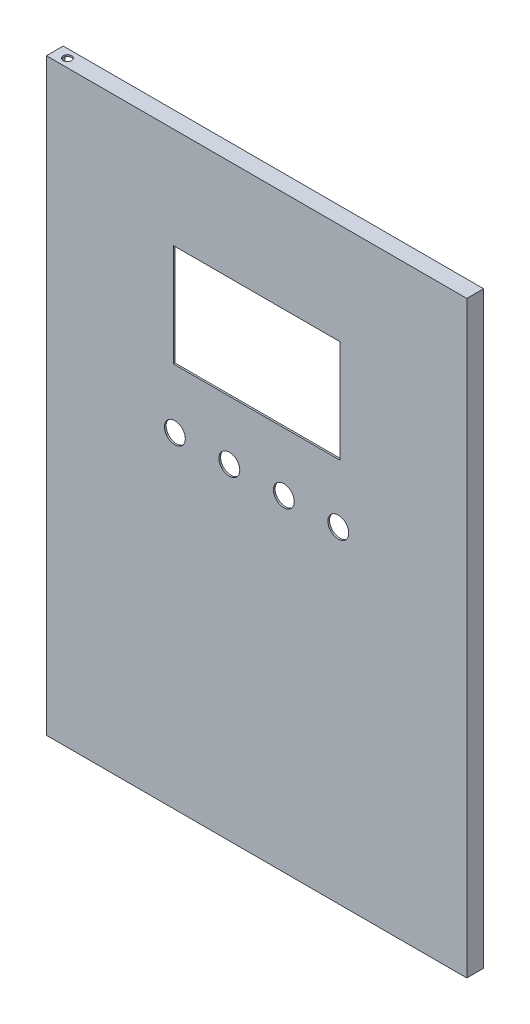
ISO-10303-21;
HEADER;
FILE_DESCRIPTION(('STEP AP214'),'2;1');
FILE_NAME('part.step','',(''),(''),'','','');
FILE_SCHEMA(('AUTOMOTIVE_DESIGN { 1 0 10303 214 1 1 1 1 }'));
ENDSEC;
DATA;
#1=APPLICATION_CONTEXT('core data for automotive mechanical design processes');
#2=APPLICATION_PROTOCOL_DEFINITION('international standard','automotive_design',2000,#1);
#3=PRODUCT_CONTEXT('',#1,'mechanical');
#4=PRODUCT('Part','Part','',(#3));
#5=PRODUCT_RELATED_PRODUCT_CATEGORY('part','',(#4));
#6=PRODUCT_DEFINITION_FORMATION('','',#4);
#7=PRODUCT_DEFINITION_CONTEXT('part definition',#1,'design');
#8=PRODUCT_DEFINITION('design','',#6,#7);
#9=PRODUCT_DEFINITION_SHAPE('','',#8);
#10=(LENGTH_UNIT() NAMED_UNIT(*) SI_UNIT(.MILLI.,.METRE.));
#11=(NAMED_UNIT(*) PLANE_ANGLE_UNIT() SI_UNIT($,.RADIAN.));
#12=(NAMED_UNIT(*) SI_UNIT($,.STERADIAN.) SOLID_ANGLE_UNIT());
#13=UNCERTAINTY_MEASURE_WITH_UNIT(LENGTH_MEASURE(1.E-05),#10,'distance_accuracy_value','');
#14=(GEOMETRIC_REPRESENTATION_CONTEXT(3) GLOBAL_UNCERTAINTY_ASSIGNED_CONTEXT((#13)) GLOBAL_UNIT_ASSIGNED_CONTEXT((#10,
#11,#12)) REPRESENTATION_CONTEXT('',''));
#15=CARTESIAN_POINT('',(0.,0.,0.));
#16=DIRECTION('',(0.,0.,1.));
#17=DIRECTION('',(1.,0.,0.));
#18=AXIS2_PLACEMENT_3D('',#15,#16,#17);
#19=CARTESIAN_POINT('',(0.,0.,10.));
#20=DIRECTION('',(1.,0.,0.));
#21=DIRECTION('',(0.,1.,0.));
#22=AXIS2_PLACEMENT_3D('',#19,#20,#21);
#23=PLANE('',#22);
#24=DIRECTION('',(0.,-1.,0.));
#25=VECTOR('',#24,1.);
#26=CARTESIAN_POINT('',(0.,0.,0.));
#27=LINE('',#26,#25);
#28=CARTESIAN_POINT('',(0.,0.,0.));
#29=VERTEX_POINT('',#28);
#30=CARTESIAN_POINT('',(0.,-350.,0.));
#31=VERTEX_POINT('',#30);
#32=EDGE_CURVE('E189',#29,#31,#27,.T.);
#33=ORIENTED_EDGE('',*,*,#32,.T.);
#34=DIRECTION('',(0.,0.,-1.));
#35=VECTOR('',#34,1.);
#36=CARTESIAN_POINT('',(0.,-350.,10.));
#37=LINE('',#36,#35);
#38=CARTESIAN_POINT('',(0.,-350.,10.));
#39=VERTEX_POINT('',#38);
#40=EDGE_CURVE('E222',#39,#31,#37,.T.);
#41=ORIENTED_EDGE('',*,*,#40,.F.);
#42=DIRECTION('',(0.,-1.,0.));
#43=VECTOR('',#42,1.);
#44=CARTESIAN_POINT('',(0.,0.,10.));
#45=LINE('',#44,#43);
#46=CARTESIAN_POINT('',(0.,0.,10.));
#47=VERTEX_POINT('',#46);
#48=EDGE_CURVE('E196',#47,#39,#45,.T.);
#49=ORIENTED_EDGE('',*,*,#48,.F.);
#50=DIRECTION('',(0.,0.,-1.));
#51=VECTOR('',#50,1.);
#52=CARTESIAN_POINT('',(0.,0.,10.));
#53=LINE('',#52,#51);
#54=EDGE_CURVE('E206',#47,#29,#53,.T.);
#55=ORIENTED_EDGE('',*,*,#54,.T.);
#56=EDGE_LOOP('',(#33,#41,#49,#55));
#57=FACE_BOUND('',#56,.T.);
#58=ADVANCED_FACE('F38',(#57),#23,.F.);
#59=CARTESIAN_POINT('',(0.,-350.,10.));
#60=DIRECTION('',(0.,1.,0.));
#61=DIRECTION('',(0.,0.,1.));
#62=AXIS2_PLACEMENT_3D('',#59,#60,#61);
#63=PLANE('',#62);
#64=CARTESIAN_POINT('',(7.5,-350.,5.));
#65=DIRECTION('',(0.,1.,0.));
#66=DIRECTION('',(0.,0.,1.));
#67=AXIS2_PLACEMENT_3D('',#64,#65,#66);
#68=CIRCLE('',#67,2.5);
#69=CARTESIAN_POINT('',(7.5,-350.,7.5));
#70=VERTEX_POINT('',#69);
#71=EDGE_CURVE('E151',#70,#70,#68,.T.);
#72=ORIENTED_EDGE('',*,*,#71,.T.);
#73=EDGE_LOOP('',(#72));
#74=FACE_BOUND('',#73,.T.);
#75=DIRECTION('',(1.,0.,0.));
#76=VECTOR('',#75,1.);
#77=CARTESIAN_POINT('',(0.,-350.,0.));
#78=LINE('',#77,#76);
#79=CARTESIAN_POINT('',(250.,-350.,0.));
#80=VERTEX_POINT('',#79);
#81=EDGE_CURVE('E209',#31,#80,#78,.T.);
#82=ORIENTED_EDGE('',*,*,#81,.T.);
#83=DIRECTION('',(0.,0.,-1.));
#84=VECTOR('',#83,1.);
#85=CARTESIAN_POINT('',(250.,-350.,10.));
#86=LINE('',#85,#84);
#87=CARTESIAN_POINT('',(250.,-350.,10.));
#88=VERTEX_POINT('',#87);
#89=EDGE_CURVE('E219',#88,#80,#86,.T.);
#90=ORIENTED_EDGE('',*,*,#89,.F.);
#91=DIRECTION('',(1.,0.,0.));
#92=VECTOR('',#91,1.);
#93=CARTESIAN_POINT('',(0.,-350.,10.));
#94=LINE('',#93,#92);
#95=EDGE_CURVE('E199',#39,#88,#94,.T.);
#96=ORIENTED_EDGE('',*,*,#95,.F.);
#97=ORIENTED_EDGE('',*,*,#40,.T.);
#98=EDGE_LOOP('',(#82,#90,#96,#97));
#99=FACE_BOUND('',#98,.T.);
#100=ADVANCED_FACE('F290',(#74,#99),#63,.F.);
#101=CARTESIAN_POINT('',(250.,0.,10.));
#102=DIRECTION('',(-1.,0.,0.));
#103=DIRECTION('',(0.,-1.,0.));
#104=AXIS2_PLACEMENT_3D('',#101,#102,#103);
#105=PLANE('',#104);
#106=DIRECTION('',(0.,1.,0.));
#107=VECTOR('',#106,1.);
#108=CARTESIAN_POINT('',(250.,0.,0.));
#109=LINE('',#108,#107);
#110=CARTESIAN_POINT('',(250.,0.,0.));
#111=VERTEX_POINT('',#110);
#112=EDGE_CURVE('E211',#80,#111,#109,.T.);
#113=ORIENTED_EDGE('',*,*,#112,.T.);
#114=DIRECTION('',(0.,0.,-1.));
#115=VECTOR('',#114,1.);
#116=CARTESIAN_POINT('',(250.,0.,10.));
#117=LINE('',#116,#115);
#118=CARTESIAN_POINT('',(250.,0.,10.));
#119=VERTEX_POINT('',#118);
#120=EDGE_CURVE('E216',#119,#111,#117,.T.);
#121=ORIENTED_EDGE('',*,*,#120,.F.);
#122=DIRECTION('',(0.,1.,0.));
#123=VECTOR('',#122,1.);
#124=CARTESIAN_POINT('',(250.,0.,10.));
#125=LINE('',#124,#123);
#126=EDGE_CURVE('E202',#88,#119,#125,.T.);
#127=ORIENTED_EDGE('',*,*,#126,.F.);
#128=ORIENTED_EDGE('',*,*,#89,.T.);
#129=EDGE_LOOP('',(#113,#121,#127,#128));
#130=FACE_BOUND('',#129,.T.);
#131=ADVANCED_FACE('F295',(#130),#105,.F.);
#132=CARTESIAN_POINT('',(0.,0.,10.));
#133=DIRECTION('',(0.,-1.,0.));
#134=DIRECTION('',(0.,0.,-1.));
#135=AXIS2_PLACEMENT_3D('',#132,#133,#134);
#136=PLANE('',#135);
#137=CARTESIAN_POINT('',(7.5,0.,5.));
#138=DIRECTION('',(0.,-1.,0.));
#139=DIRECTION('',(0.,0.,-1.));
#140=AXIS2_PLACEMENT_3D('',#137,#138,#139);
#141=CIRCLE('',#140,2.5);
#142=CARTESIAN_POINT('',(7.5,0.,2.5));
#143=VERTEX_POINT('',#142);
#144=EDGE_CURVE('E160',#143,#143,#141,.T.);
#145=ORIENTED_EDGE('',*,*,#144,.T.);
#146=EDGE_LOOP('',(#145));
#147=FACE_BOUND('',#146,.T.);
#148=DIRECTION('',(-1.,0.,0.));
#149=VECTOR('',#148,1.);
#150=CARTESIAN_POINT('',(0.,0.,0.));
#151=LINE('',#150,#149);
#152=EDGE_CURVE('E200',#111,#29,#151,.T.);
#153=ORIENTED_EDGE('',*,*,#152,.T.);
#154=ORIENTED_EDGE('',*,*,#54,.F.);
#155=DIRECTION('',(-1.,0.,0.));
#156=VECTOR('',#155,1.);
#157=CARTESIAN_POINT('',(0.,0.,10.));
#158=LINE('',#157,#156);
#159=EDGE_CURVE('E204',#119,#47,#158,.T.);
#160=ORIENTED_EDGE('',*,*,#159,.F.);
#161=ORIENTED_EDGE('',*,*,#120,.T.);
#162=EDGE_LOOP('',(#153,#154,#160,#161));
#163=FACE_BOUND('',#162,.T.);
#164=ADVANCED_FACE('F269',(#147,#163),#136,.F.);
#165=CARTESIAN_POINT('',(0.,0.,10.));
#166=DIRECTION('',(0.,0.,1.));
#167=DIRECTION('',(1.,0.,0.));
#168=AXIS2_PLACEMENT_3D('',#165,#166,#167);
#169=PLANE('',#168);
#170=CARTESIAN_POINT('',(173.6,-156.,10.));
#171=DIRECTION('',(0.,0.,1.));
#172=DIRECTION('',(-1.,0.,0.));
#173=AXIS2_PLACEMENT_3D('',#170,#171,#172);
#174=CIRCLE('',#173,6.20000000000001);
#175=CARTESIAN_POINT('',(167.4,-156.,10.));
#176=VERTEX_POINT('',#175);
#177=EDGE_CURVE('E249',#176,#176,#174,.T.);
#178=ORIENTED_EDGE('',*,*,#177,.F.);
#179=EDGE_LOOP('',(#178));
#180=FACE_BOUND('',#179,.T.);
#181=CARTESIAN_POINT('',(76.4,-156.,10.));
#182=DIRECTION('',(0.,0.,1.));
#183=DIRECTION('',(1.,0.,0.));
#184=AXIS2_PLACEMENT_3D('',#181,#182,#183);
#185=CIRCLE('',#184,6.19999999999999);
#186=CARTESIAN_POINT('',(82.6,-156.,10.));
#187=VERTEX_POINT('',#186);
#188=EDGE_CURVE('E255',#187,#187,#185,.T.);
#189=ORIENTED_EDGE('',*,*,#188,.F.);
#190=EDGE_LOOP('',(#189));
#191=FACE_BOUND('',#190,.T.);
#192=CARTESIAN_POINT('',(141.2,-156.,10.));
#193=DIRECTION('',(0.,0.,1.));
#194=DIRECTION('',(1.,0.,0.));
#195=AXIS2_PLACEMENT_3D('',#192,#193,#194);
#196=CIRCLE('',#195,6.20000000000001);
#197=CARTESIAN_POINT('',(147.4,-156.,10.));
#198=VERTEX_POINT('',#197);
#199=EDGE_CURVE('E244',#198,#198,#196,.T.);
#200=ORIENTED_EDGE('',*,*,#199,.F.);
#201=EDGE_LOOP('',(#200));
#202=FACE_BOUND('',#201,.T.);
#203=CARTESIAN_POINT('',(108.8,-156.,10.));
#204=DIRECTION('',(0.,0.,1.));
#205=DIRECTION('',(1.,0.,0.));
#206=AXIS2_PLACEMENT_3D('',#203,#204,#205);
#207=CIRCLE('',#206,6.20000000000001);
#208=CARTESIAN_POINT('',(115.,-156.,10.));
#209=VERTEX_POINT('',#208);
#210=EDGE_CURVE('E238',#209,#209,#207,.T.);
#211=ORIENTED_EDGE('',*,*,#210,.F.);
#212=EDGE_LOOP('',(#211));
#213=FACE_BOUND('',#212,.T.);
#214=DIRECTION('',(1.,0.,0.));
#215=VECTOR('',#214,1.);
#216=CARTESIAN_POINT('',(75.5,-121.,10.));
#217=LINE('',#216,#215);
#218=CARTESIAN_POINT('',(75.5,-121.,10.));
#219=VERTEX_POINT('',#218);
#220=CARTESIAN_POINT('',(174.5,-121.,10.));
#221=VERTEX_POINT('',#220);
#222=EDGE_CURVE('E52',#219,#221,#217,.T.);
#223=ORIENTED_EDGE('',*,*,#222,.F.);
#224=DIRECTION('',(0.,-1.,0.));
#225=VECTOR('',#224,1.);
#226=CARTESIAN_POINT('',(75.5,-60.,10.));
#227=LINE('',#226,#225);
#228=CARTESIAN_POINT('',(75.5,-60.,10.));
#229=VERTEX_POINT('',#228);
#230=EDGE_CURVE('E144',#229,#219,#227,.T.);
#231=ORIENTED_EDGE('',*,*,#230,.F.);
#232=DIRECTION('',(1.,0.,0.));
#233=VECTOR('',#232,1.);
#234=CARTESIAN_POINT('',(75.5,-60.,10.));
#235=LINE('',#234,#233);
#236=CARTESIAN_POINT('',(174.5,-60.,10.));
#237=VERTEX_POINT('',#236);
#238=EDGE_CURVE('E128',#229,#237,#235,.T.);
#239=ORIENTED_EDGE('',*,*,#238,.T.);
#240=DIRECTION('',(0.,-1.,0.));
#241=VECTOR('',#240,1.);
#242=CARTESIAN_POINT('',(174.5,-60.,10.));
#243=LINE('',#242,#241);
#244=EDGE_CURVE('E137',#237,#221,#243,.T.);
#245=ORIENTED_EDGE('',*,*,#244,.T.);
#246=EDGE_LOOP('',(#223,#231,#239,#245));
#247=FACE_BOUND('',#246,.T.);
#248=ORIENTED_EDGE('',*,*,#48,.T.);
#249=ORIENTED_EDGE('',*,*,#95,.T.);
#250=ORIENTED_EDGE('',*,*,#126,.T.);
#251=ORIENTED_EDGE('',*,*,#159,.T.);
#252=EDGE_LOOP('',(#248,#249,#250,#251));
#253=FACE_BOUND('',#252,.T.);
#254=ADVANCED_FACE('F141',(#180,#191,#202,#213,#247,#253),#169,.T.);
#255=CARTESIAN_POINT('',(0.,0.,0.));
#256=DIRECTION('',(0.,0.,1.));
#257=DIRECTION('',(1.,0.,0.));
#258=AXIS2_PLACEMENT_3D('',#255,#256,#257);
#259=PLANE('',#258);
#260=DIRECTION('',(0.,-1.,0.));
#261=VECTOR('',#260,1.);
#262=CARTESIAN_POINT('',(249.,-1.00000000000005,0.));
#263=LINE('',#262,#261);
#264=CARTESIAN_POINT('',(249.,-1.00000000000005,0.));
#265=VERTEX_POINT('',#264);
#266=CARTESIAN_POINT('',(249.,-349.,0.));
#267=VERTEX_POINT('',#266);
#268=EDGE_CURVE('E179',#265,#267,#263,.T.);
#269=ORIENTED_EDGE('',*,*,#268,.F.);
#270=DIRECTION('',(1.,0.,0.));
#271=VECTOR('',#270,1.);
#272=CARTESIAN_POINT('',(1.,-1.,0.));
#273=LINE('',#272,#271);
#274=CARTESIAN_POINT('',(1.,-1.,0.));
#275=VERTEX_POINT('',#274);
#276=EDGE_CURVE('E163',#275,#265,#273,.T.);
#277=ORIENTED_EDGE('',*,*,#276,.F.);
#278=DIRECTION('',(0.,1.,0.));
#279=VECTOR('',#278,1.);
#280=CARTESIAN_POINT('',(1.,-349.,0.));
#281=LINE('',#280,#279);
#282=CARTESIAN_POINT('',(1.,-349.,0.));
#283=VERTEX_POINT('',#282);
#284=EDGE_CURVE('E168',#283,#275,#281,.T.);
#285=ORIENTED_EDGE('',*,*,#284,.F.);
#286=DIRECTION('',(-1.,0.,0.));
#287=VECTOR('',#286,1.);
#288=CARTESIAN_POINT('',(249.,-349.,0.));
#289=LINE('',#288,#287);
#290=EDGE_CURVE('E182',#267,#283,#289,.T.);
#291=ORIENTED_EDGE('',*,*,#290,.F.);
#292=EDGE_LOOP('',(#269,#277,#285,#291));
#293=FACE_BOUND('',#292,.T.);
#294=ORIENTED_EDGE('',*,*,#32,.F.);
#295=ORIENTED_EDGE('',*,*,#152,.F.);
#296=ORIENTED_EDGE('',*,*,#112,.F.);
#297=ORIENTED_EDGE('',*,*,#81,.F.);
#298=EDGE_LOOP('',(#294,#295,#296,#297));
#299=FACE_BOUND('',#298,.T.);
#300=ADVANCED_FACE('F268',(#293,#299),#259,.F.);
#301=CARTESIAN_POINT('',(1.,-1.,9.));
#302=DIRECTION('',(0.,1.,0.));
#303=DIRECTION('',(-1.,0.,0.));
#304=AXIS2_PLACEMENT_3D('',#301,#302,#303);
#305=PLANE('',#304);
#306=CARTESIAN_POINT('',(7.5,-1.,5.));
#307=DIRECTION('',(0.,1.,0.));
#308=DIRECTION('',(-1.,0.,0.));
#309=AXIS2_PLACEMENT_3D('',#306,#307,#308);
#310=CIRCLE('',#309,2.5);
#311=CARTESIAN_POINT('',(5.,-1.,5.));
#312=VERTEX_POINT('',#311);
#313=EDGE_CURVE('E157',#312,#312,#310,.T.);
#314=ORIENTED_EDGE('',*,*,#313,.T.);
#315=EDGE_LOOP('',(#314));
#316=FACE_BOUND('',#315,.T.);
#317=ORIENTED_EDGE('',*,*,#276,.T.);
#318=DIRECTION('',(0.,0.,-1.));
#319=VECTOR('',#318,1.);
#320=CARTESIAN_POINT('',(249.,-1.00000000000005,9.));
#321=LINE('',#320,#319);
#322=CARTESIAN_POINT('',(249.,-1.00000000000005,9.));
#323=VERTEX_POINT('',#322);
#324=EDGE_CURVE('E177',#323,#265,#321,.T.);
#325=ORIENTED_EDGE('',*,*,#324,.F.);
#326=DIRECTION('',(1.,0.,0.));
#327=VECTOR('',#326,1.);
#328=CARTESIAN_POINT('',(1.,-1.,9.));
#329=LINE('',#328,#327);
#330=CARTESIAN_POINT('',(1.,-1.,9.));
#331=VERTEX_POINT('',#330);
#332=EDGE_CURVE('E164',#331,#323,#329,.T.);
#333=ORIENTED_EDGE('',*,*,#332,.F.);
#334=DIRECTION('',(0.,0.,-1.));
#335=VECTOR('',#334,1.);
#336=CARTESIAN_POINT('',(1.,-1.,9.));
#337=LINE('',#336,#335);
#338=EDGE_CURVE('E187',#331,#275,#337,.T.);
#339=ORIENTED_EDGE('',*,*,#338,.T.);
#340=EDGE_LOOP('',(#317,#325,#333,#339));
#341=FACE_BOUND('',#340,.T.);
#342=ADVANCED_FACE('F320',(#316,#341),#305,.F.);
#343=CARTESIAN_POINT('',(1.,-349.,9.));
#344=DIRECTION('',(-1.,0.,0.));
#345=DIRECTION('',(0.,0.,1.));
#346=AXIS2_PLACEMENT_3D('',#343,#344,#345);
#347=PLANE('',#346);
#348=ORIENTED_EDGE('',*,*,#284,.T.);
#349=ORIENTED_EDGE('',*,*,#338,.F.);
#350=DIRECTION('',(0.,1.,0.));
#351=VECTOR('',#350,1.);
#352=CARTESIAN_POINT('',(1.,-349.,9.));
#353=LINE('',#352,#351);
#354=CARTESIAN_POINT('',(1.,-349.,9.));
#355=VERTEX_POINT('',#354);
#356=EDGE_CURVE('E174',#355,#331,#353,.T.);
#357=ORIENTED_EDGE('',*,*,#356,.F.);
#358=DIRECTION('',(0.,0.,-1.));
#359=VECTOR('',#358,1.);
#360=CARTESIAN_POINT('',(1.,-349.,9.));
#361=LINE('',#360,#359);
#362=EDGE_CURVE('E190',#355,#283,#361,.T.);
#363=ORIENTED_EDGE('',*,*,#362,.T.);
#364=EDGE_LOOP('',(#348,#349,#357,#363));
#365=FACE_BOUND('',#364,.T.);
#366=ADVANCED_FACE('F325',(#365),#347,.F.);
#367=CARTESIAN_POINT('',(249.,-349.,9.));
#368=DIRECTION('',(0.,-1.,0.));
#369=DIRECTION('',(0.,0.,-1.));
#370=AXIS2_PLACEMENT_3D('',#367,#368,#369);
#371=PLANE('',#370);
#372=CARTESIAN_POINT('',(7.5,-349.,5.));
#373=DIRECTION('',(0.,-1.,0.));
#374=DIRECTION('',(0.,0.,-1.));
#375=AXIS2_PLACEMENT_3D('',#372,#373,#374);
#376=CIRCLE('',#375,2.5);
#377=CARTESIAN_POINT('',(7.5,-349.,2.5));
#378=VERTEX_POINT('',#377);
#379=EDGE_CURVE('E156',#378,#378,#376,.T.);
#380=ORIENTED_EDGE('',*,*,#379,.T.);
#381=EDGE_LOOP('',(#380));
#382=FACE_BOUND('',#381,.T.);
#383=ORIENTED_EDGE('',*,*,#290,.T.);
#384=ORIENTED_EDGE('',*,*,#362,.F.);
#385=DIRECTION('',(-1.,0.,0.));
#386=VECTOR('',#385,1.);
#387=CARTESIAN_POINT('',(249.,-349.,9.));
#388=LINE('',#387,#386);
#389=CARTESIAN_POINT('',(249.,-349.,9.));
#390=VERTEX_POINT('',#389);
#391=EDGE_CURVE('E171',#390,#355,#388,.T.);
#392=ORIENTED_EDGE('',*,*,#391,.F.);
#393=DIRECTION('',(0.,0.,-1.));
#394=VECTOR('',#393,1.);
#395=CARTESIAN_POINT('',(249.,-349.,9.));
#396=LINE('',#395,#394);
#397=EDGE_CURVE('E192',#390,#267,#396,.T.);
#398=ORIENTED_EDGE('',*,*,#397,.T.);
#399=EDGE_LOOP('',(#383,#384,#392,#398));
#400=FACE_BOUND('',#399,.T.);
#401=ADVANCED_FACE('F330',(#382,#400),#371,.F.);
#402=CARTESIAN_POINT('',(249.,-1.00000000000005,9.));
#403=DIRECTION('',(1.,0.,0.));
#404=DIRECTION('',(0.,1.,0.));
#405=AXIS2_PLACEMENT_3D('',#402,#403,#404);
#406=PLANE('',#405);
#407=ORIENTED_EDGE('',*,*,#268,.T.);
#408=ORIENTED_EDGE('',*,*,#397,.F.);
#409=DIRECTION('',(0.,-1.,0.));
#410=VECTOR('',#409,1.);
#411=CARTESIAN_POINT('',(249.,-1.00000000000005,9.));
#412=LINE('',#411,#410);
#413=EDGE_CURVE('E167',#323,#390,#412,.T.);
#414=ORIENTED_EDGE('',*,*,#413,.F.);
#415=ORIENTED_EDGE('',*,*,#324,.T.);
#416=EDGE_LOOP('',(#407,#408,#414,#415));
#417=FACE_BOUND('',#416,.T.);
#418=ADVANCED_FACE('F327',(#417),#406,.F.);
#419=CARTESIAN_POINT('',(0.,0.,9.));
#420=DIRECTION('',(0.,0.,-1.));
#421=DIRECTION('',(-1.,0.,0.));
#422=AXIS2_PLACEMENT_3D('',#419,#420,#421);
#423=PLANE('',#422);
#424=CARTESIAN_POINT('',(173.6,-156.,9.));
#425=DIRECTION('',(0.,0.,-1.));
#426=DIRECTION('',(-1.,0.,0.));
#427=AXIS2_PLACEMENT_3D('',#424,#425,#426);
#428=CIRCLE('',#427,6.20000000000001);
#429=CARTESIAN_POINT('',(167.4,-156.,9.));
#430=VERTEX_POINT('',#429);
#431=EDGE_CURVE('E246',#430,#430,#428,.F.);
#432=ORIENTED_EDGE('',*,*,#431,.T.);
#433=EDGE_LOOP('',(#432));
#434=FACE_BOUND('',#433,.T.);
#435=CARTESIAN_POINT('',(76.4,-156.,9.));
#436=DIRECTION('',(0.,0.,-1.));
#437=DIRECTION('',(-1.,0.,0.));
#438=AXIS2_PLACEMENT_3D('',#435,#436,#437);
#439=CIRCLE('',#438,6.19999999999999);
#440=CARTESIAN_POINT('',(70.2,-156.,9.));
#441=VERTEX_POINT('',#440);
#442=EDGE_CURVE('E252',#441,#441,#439,.F.);
#443=ORIENTED_EDGE('',*,*,#442,.T.);
#444=EDGE_LOOP('',(#443));
#445=FACE_BOUND('',#444,.T.);
#446=CARTESIAN_POINT('',(141.2,-156.,9.));
#447=DIRECTION('',(0.,0.,-1.));
#448=DIRECTION('',(-1.,0.,0.));
#449=AXIS2_PLACEMENT_3D('',#446,#447,#448);
#450=CIRCLE('',#449,6.20000000000001);
#451=CARTESIAN_POINT('',(135.,-156.,9.));
#452=VERTEX_POINT('',#451);
#453=EDGE_CURVE('E258',#452,#452,#450,.F.);
#454=ORIENTED_EDGE('',*,*,#453,.T.);
#455=EDGE_LOOP('',(#454));
#456=FACE_BOUND('',#455,.T.);
#457=CARTESIAN_POINT('',(108.8,-156.,9.));
#458=DIRECTION('',(0.,0.,-1.));
#459=DIRECTION('',(-1.,0.,0.));
#460=AXIS2_PLACEMENT_3D('',#457,#458,#459);
#461=CIRCLE('',#460,6.20000000000001);
#462=CARTESIAN_POINT('',(102.6,-156.,9.));
#463=VERTEX_POINT('',#462);
#464=EDGE_CURVE('E240',#463,#463,#461,.F.);
#465=ORIENTED_EDGE('',*,*,#464,.T.);
#466=EDGE_LOOP('',(#465));
#467=FACE_BOUND('',#466,.T.);
#468=DIRECTION('',(-1.,0.,0.));
#469=VECTOR('',#468,1.);
#470=CARTESIAN_POINT('',(0.,-121.,9.));
#471=LINE('',#470,#469);
#472=CARTESIAN_POINT('',(174.5,-121.,9.));
#473=VERTEX_POINT('',#472);
#474=CARTESIAN_POINT('',(75.5,-121.,9.));
#475=VERTEX_POINT('',#474);
#476=EDGE_CURVE('E11',#473,#475,#471,.T.);
#477=ORIENTED_EDGE('',*,*,#476,.F.);
#478=DIRECTION('',(0.,1.,0.));
#479=VECTOR('',#478,1.);
#480=CARTESIAN_POINT('',(174.5,0.,9.));
#481=LINE('',#480,#479);
#482=CARTESIAN_POINT('',(174.5,-60.,9.));
#483=VERTEX_POINT('',#482);
#484=EDGE_CURVE('E225',#473,#483,#481,.T.);
#485=ORIENTED_EDGE('',*,*,#484,.T.);
#486=DIRECTION('',(-1.,0.,0.));
#487=VECTOR('',#486,1.);
#488=CARTESIAN_POINT('',(0.,-60.,9.));
#489=LINE('',#488,#487);
#490=CARTESIAN_POINT('',(75.5,-60.,9.));
#491=VERTEX_POINT('',#490);
#492=EDGE_CURVE('E131',#483,#491,#489,.T.);
#493=ORIENTED_EDGE('',*,*,#492,.T.);
#494=DIRECTION('',(0.,1.,0.));
#495=VECTOR('',#494,1.);
#496=CARTESIAN_POINT('',(75.5,0.,9.));
#497=LINE('',#496,#495);
#498=EDGE_CURVE('E45',#475,#491,#497,.T.);
#499=ORIENTED_EDGE('',*,*,#498,.F.);
#500=EDGE_LOOP('',(#477,#485,#493,#499));
#501=FACE_BOUND('',#500,.T.);
#502=ORIENTED_EDGE('',*,*,#332,.T.);
#503=ORIENTED_EDGE('',*,*,#413,.T.);
#504=ORIENTED_EDGE('',*,*,#391,.T.);
#505=ORIENTED_EDGE('',*,*,#356,.T.);
#506=EDGE_LOOP('',(#502,#503,#504,#505));
#507=FACE_BOUND('',#506,.T.);
#508=ADVANCED_FACE('F235',(#434,#445,#456,#467,#501,#507),#423,.T.);
#509=CARTESIAN_POINT('',(7.5,-350.,5.));
#510=DIRECTION('',(0.,1.,0.));
#511=DIRECTION('',(0.,0.,1.));
#512=AXIS2_PLACEMENT_3D('',#509,#510,#511);
#513=CYLINDRICAL_SURFACE('',#512,2.5);
#514=ORIENTED_EDGE('',*,*,#71,.F.);
#515=EDGE_LOOP('',(#514));
#516=FACE_BOUND('',#515,.T.);
#517=ORIENTED_EDGE('',*,*,#379,.F.);
#518=EDGE_LOOP('',(#517));
#519=FACE_BOUND('',#518,.T.);
#520=ADVANCED_FACE('F340',(#516,#519),#513,.F.);
#521=ORIENTED_EDGE('',*,*,#313,.F.);
#522=EDGE_LOOP('',(#521));
#523=FACE_BOUND('',#522,.T.);
#524=ORIENTED_EDGE('',*,*,#144,.F.);
#525=EDGE_LOOP('',(#524));
#526=FACE_BOUND('',#525,.T.);
#527=ADVANCED_FACE('F342',(#523,#526),#513,.F.);
#528=CARTESIAN_POINT('',(75.5,-121.,0.));
#529=DIRECTION('',(0.,-1.,0.));
#530=DIRECTION('',(0.,0.,-1.));
#531=AXIS2_PLACEMENT_3D('',#528,#529,#530);
#532=PLANE('',#531);
#533=ORIENTED_EDGE('',*,*,#476,.T.);
#534=DIRECTION('',(0.,0.,1.));
#535=VECTOR('',#534,1.);
#536=CARTESIAN_POINT('',(75.5,-121.,0.));
#537=LINE('',#536,#535);
#538=EDGE_CURVE('E149',#475,#219,#537,.T.);
#539=ORIENTED_EDGE('',*,*,#538,.T.);
#540=ORIENTED_EDGE('',*,*,#222,.T.);
#541=DIRECTION('',(0.,0.,1.));
#542=VECTOR('',#541,1.);
#543=CARTESIAN_POINT('',(174.5,-121.,0.));
#544=LINE('',#543,#542);
#545=EDGE_CURVE('E134',#473,#221,#544,.T.);
#546=ORIENTED_EDGE('',*,*,#545,.F.);
#547=EDGE_LOOP('',(#533,#539,#540,#546));
#548=FACE_BOUND('',#547,.T.);
#549=ADVANCED_FACE('F237',(#548),#532,.F.);
#550=CARTESIAN_POINT('',(75.5,-60.,0.));
#551=DIRECTION('',(-1.,0.,0.));
#552=DIRECTION('',(0.,0.,1.));
#553=AXIS2_PLACEMENT_3D('',#550,#551,#552);
#554=PLANE('',#553);
#555=ORIENTED_EDGE('',*,*,#498,.T.);
#556=DIRECTION('',(0.,0.,1.));
#557=VECTOR('',#556,1.);
#558=CARTESIAN_POINT('',(75.5,-60.,0.));
#559=LINE('',#558,#557);
#560=EDGE_CURVE('E133',#491,#229,#559,.T.);
#561=ORIENTED_EDGE('',*,*,#560,.T.);
#562=ORIENTED_EDGE('',*,*,#230,.T.);
#563=ORIENTED_EDGE('',*,*,#538,.F.);
#564=EDGE_LOOP('',(#555,#561,#562,#563));
#565=FACE_BOUND('',#564,.T.);
#566=ADVANCED_FACE('F232',(#565),#554,.F.);
#567=CARTESIAN_POINT('',(75.5,-60.,0.));
#568=DIRECTION('',(0.,-1.,0.));
#569=DIRECTION('',(0.,0.,-1.));
#570=AXIS2_PLACEMENT_3D('',#567,#568,#569);
#571=PLANE('',#570);
#572=DIRECTION('',(0.,0.,1.));
#573=VECTOR('',#572,1.);
#574=CARTESIAN_POINT('',(174.5,-60.,0.));
#575=LINE('',#574,#573);
#576=EDGE_CURVE('E60',#483,#237,#575,.T.);
#577=ORIENTED_EDGE('',*,*,#576,.T.);
#578=ORIENTED_EDGE('',*,*,#238,.F.);
#579=ORIENTED_EDGE('',*,*,#560,.F.);
#580=ORIENTED_EDGE('',*,*,#492,.F.);
#581=EDGE_LOOP('',(#577,#578,#579,#580));
#582=FACE_BOUND('',#581,.T.);
#583=ADVANCED_FACE('F125',(#582),#571,.T.);
#584=CARTESIAN_POINT('',(174.5,-60.,0.));
#585=DIRECTION('',(-1.,0.,0.));
#586=DIRECTION('',(0.,0.,1.));
#587=AXIS2_PLACEMENT_3D('',#584,#585,#586);
#588=PLANE('',#587);
#589=ORIENTED_EDGE('',*,*,#545,.T.);
#590=ORIENTED_EDGE('',*,*,#244,.F.);
#591=ORIENTED_EDGE('',*,*,#576,.F.);
#592=ORIENTED_EDGE('',*,*,#484,.F.);
#593=EDGE_LOOP('',(#589,#590,#591,#592));
#594=FACE_BOUND('',#593,.T.);
#595=ADVANCED_FACE('F138',(#594),#588,.T.);
#596=CARTESIAN_POINT('',(108.8,-156.,-0.000999999999999265));
#597=DIRECTION('',(0.,0.,1.));
#598=DIRECTION('',(1.,0.,0.));
#599=AXIS2_PLACEMENT_3D('',#596,#597,#598);
#600=CYLINDRICAL_SURFACE('',#599,6.20000000000001);
#601=ORIENTED_EDGE('',*,*,#464,.F.);
#602=EDGE_LOOP('',(#601));
#603=FACE_BOUND('',#602,.T.);
#604=ORIENTED_EDGE('',*,*,#210,.T.);
#605=EDGE_LOOP('',(#604));
#606=FACE_BOUND('',#605,.T.);
#607=ADVANCED_FACE('F274',(#603,#606),#600,.F.);
#608=CARTESIAN_POINT('',(141.2,-156.,-0.000999999999999265));
#609=DIRECTION('',(0.,0.,1.));
#610=DIRECTION('',(1.,0.,0.));
#611=AXIS2_PLACEMENT_3D('',#608,#609,#610);
#612=CYLINDRICAL_SURFACE('',#611,6.20000000000001);
#613=ORIENTED_EDGE('',*,*,#453,.F.);
#614=EDGE_LOOP('',(#613));
#615=FACE_BOUND('',#614,.T.);
#616=ORIENTED_EDGE('',*,*,#199,.T.);
#617=EDGE_LOOP('',(#616));
#618=FACE_BOUND('',#617,.T.);
#619=ADVANCED_FACE('F264',(#615,#618),#612,.F.);
#620=CARTESIAN_POINT('',(76.4,-156.,-0.000999999999999265));
#621=DIRECTION('',(0.,0.,1.));
#622=DIRECTION('',(1.,0.,0.));
#623=AXIS2_PLACEMENT_3D('',#620,#621,#622);
#624=CYLINDRICAL_SURFACE('',#623,6.19999999999999);
#625=ORIENTED_EDGE('',*,*,#442,.F.);
#626=EDGE_LOOP('',(#625));
#627=FACE_BOUND('',#626,.T.);
#628=ORIENTED_EDGE('',*,*,#188,.T.);
#629=EDGE_LOOP('',(#628));
#630=FACE_BOUND('',#629,.T.);
#631=ADVANCED_FACE('F282',(#627,#630),#624,.F.);
#632=CARTESIAN_POINT('',(173.6,-156.,-0.000999999999999265));
#633=DIRECTION('',(0.,0.,1.));
#634=DIRECTION('',(1.,0.,0.));
#635=AXIS2_PLACEMENT_3D('',#632,#633,#634);
#636=CYLINDRICAL_SURFACE('',#635,6.20000000000001);
#637=ORIENTED_EDGE('',*,*,#431,.F.);
#638=EDGE_LOOP('',(#637));
#639=FACE_BOUND('',#638,.T.);
#640=ORIENTED_EDGE('',*,*,#177,.T.);
#641=EDGE_LOOP('',(#640));
#642=FACE_BOUND('',#641,.T.);
#643=ADVANCED_FACE('F398',(#639,#642),#636,.F.);
#644=CLOSED_SHELL('',(#58,#100,#131,#164,#254,#300,#342,#366,#401,#418,#508,#520,#527,#549,#566,
#583,#595,#607,#619,#631,#643));
#645=MANIFOLD_SOLID_BREP('B2',#644);
#646=ADVANCED_BREP_SHAPE_REPRESENTATION('',(#18,#645),#14);
#647=SHAPE_DEFINITION_REPRESENTATION(#9,#646);
ENDSEC;
END-ISO-10303-21;
